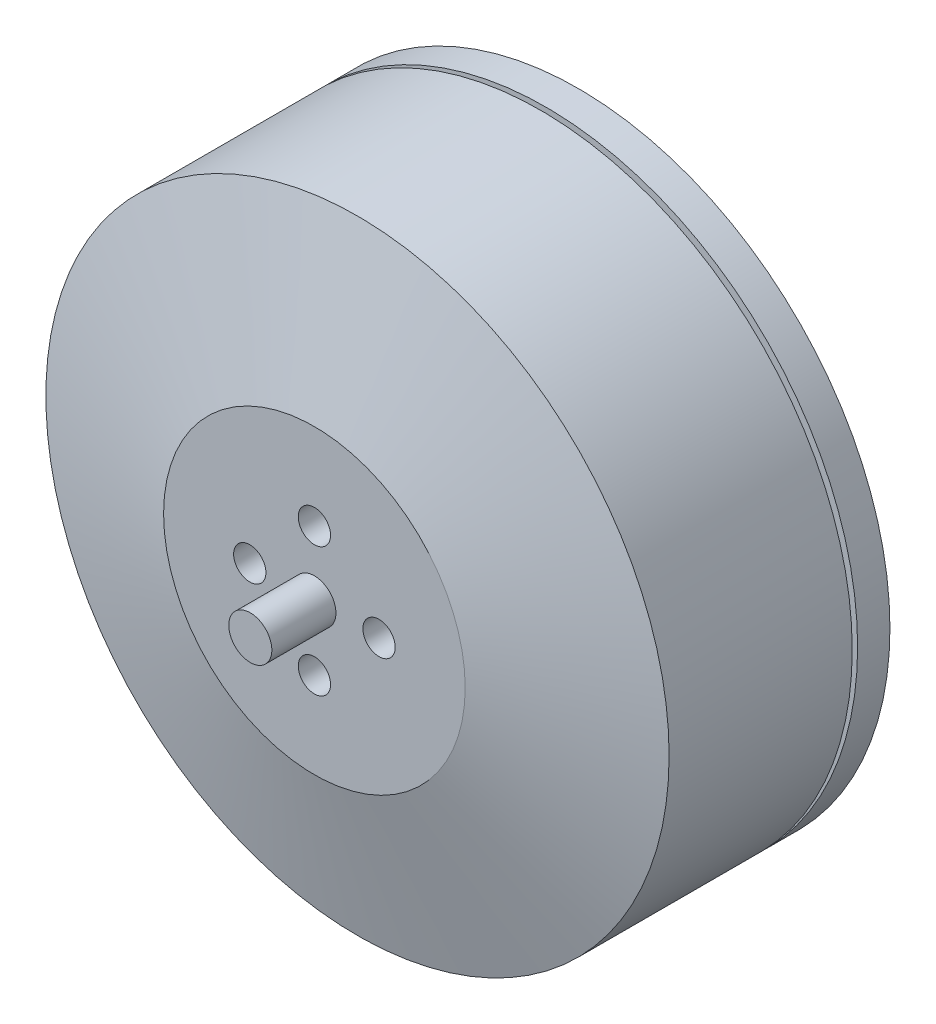
ISO-10303-21;
HEADER;
FILE_DESCRIPTION(('STEP AP214'),'2;1');
FILE_NAME('part.step','',(''),(''),'','','');
FILE_SCHEMA(('AUTOMOTIVE_DESIGN { 1 0 10303 214 1 1 1 1 }'));
ENDSEC;
DATA;
#1=APPLICATION_CONTEXT('core data for automotive mechanical design processes');
#2=APPLICATION_PROTOCOL_DEFINITION('international standard','automotive_design',2000,#1);
#3=PRODUCT_CONTEXT('',#1,'mechanical');
#4=PRODUCT('Part','Part','',(#3));
#5=PRODUCT_RELATED_PRODUCT_CATEGORY('part','',(#4));
#6=PRODUCT_DEFINITION_FORMATION('','',#4);
#7=PRODUCT_DEFINITION_CONTEXT('part definition',#1,'design');
#8=PRODUCT_DEFINITION('design','',#6,#7);
#9=PRODUCT_DEFINITION_SHAPE('','',#8);
#10=(LENGTH_UNIT() NAMED_UNIT(*) SI_UNIT(.MILLI.,.METRE.));
#11=(NAMED_UNIT(*) PLANE_ANGLE_UNIT() SI_UNIT($,.RADIAN.));
#12=(NAMED_UNIT(*) SI_UNIT($,.STERADIAN.) SOLID_ANGLE_UNIT());
#13=UNCERTAINTY_MEASURE_WITH_UNIT(LENGTH_MEASURE(1.E-05),#10,'distance_accuracy_value','');
#14=(GEOMETRIC_REPRESENTATION_CONTEXT(3) GLOBAL_UNCERTAINTY_ASSIGNED_CONTEXT((#13)) GLOBAL_UNIT_ASSIGNED_CONTEXT((#10,
#11,#12)) REPRESENTATION_CONTEXT('',''));
#15=CARTESIAN_POINT('',(0.,0.,0.));
#16=DIRECTION('',(0.,0.,1.));
#17=DIRECTION('',(1.,0.,0.));
#18=AXIS2_PLACEMENT_3D('',#15,#16,#17);
#19=CARTESIAN_POINT('',(0.,0.,29.5));
#20=DIRECTION('',(0.,0.,-1.));
#21=DIRECTION('',(-1.,0.,0.));
#22=AXIS2_PLACEMENT_3D('',#19,#20,#21);
#23=PLANE('',#22);
#24=CARTESIAN_POINT('',(0.,6.,29.5));
#25=DIRECTION('',(0.,0.,1.));
#26=DIRECTION('',(1.,0.,0.));
#27=AXIS2_PLACEMENT_3D('',#24,#25,#26);
#28=CIRCLE('',#27,1.5);
#29=CARTESIAN_POINT('',(1.5,6.,29.5));
#30=VERTEX_POINT('',#29);
#31=EDGE_CURVE('E193',#30,#30,#28,.T.);
#32=ORIENTED_EDGE('',*,*,#31,.F.);
#33=EDGE_LOOP('',(#32));
#34=FACE_BOUND('',#33,.T.);
#35=CARTESIAN_POINT('',(6.,0.,29.5));
#36=DIRECTION('',(0.,0.,1.));
#37=DIRECTION('',(1.,0.,0.));
#38=AXIS2_PLACEMENT_3D('',#35,#36,#37);
#39=CIRCLE('',#38,1.5);
#40=CARTESIAN_POINT('',(7.5,0.,29.5));
#41=VERTEX_POINT('',#40);
#42=EDGE_CURVE('E196',#41,#41,#39,.T.);
#43=ORIENTED_EDGE('',*,*,#42,.F.);
#44=EDGE_LOOP('',(#43));
#45=FACE_BOUND('',#44,.T.);
#46=CARTESIAN_POINT('',(0.,-6.,29.5));
#47=DIRECTION('',(0.,0.,1.));
#48=DIRECTION('',(1.,0.,0.));
#49=AXIS2_PLACEMENT_3D('',#46,#47,#48);
#50=CIRCLE('',#49,1.5);
#51=CARTESIAN_POINT('',(1.5,-6.,29.5));
#52=VERTEX_POINT('',#51);
#53=EDGE_CURVE('E203',#52,#52,#50,.T.);
#54=ORIENTED_EDGE('',*,*,#53,.F.);
#55=EDGE_LOOP('',(#54));
#56=FACE_BOUND('',#55,.T.);
#57=CARTESIAN_POINT('',(-6.,0.,29.5));
#58=DIRECTION('',(0.,0.,1.));
#59=DIRECTION('',(1.,0.,0.));
#60=AXIS2_PLACEMENT_3D('',#57,#58,#59);
#61=CIRCLE('',#60,1.5);
#62=CARTESIAN_POINT('',(-4.5,0.,29.5));
#63=VERTEX_POINT('',#62);
#64=EDGE_CURVE('E211',#63,#63,#61,.T.);
#65=ORIENTED_EDGE('',*,*,#64,.F.);
#66=EDGE_LOOP('',(#65));
#67=FACE_BOUND('',#66,.T.);
#68=CARTESIAN_POINT('',(0.,0.,29.5));
#69=DIRECTION('',(0.,0.,-1.));
#70=DIRECTION('',(-1.,0.,0.));
#71=AXIS2_PLACEMENT_3D('',#68,#69,#70);
#72=CIRCLE('',#71,2.);
#73=CARTESIAN_POINT('',(-2.,0.,29.5));
#74=VERTEX_POINT('',#73);
#75=EDGE_CURVE('E55',#74,#74,#72,.F.);
#76=ORIENTED_EDGE('',*,*,#75,.F.);
#77=EDGE_LOOP('',(#76));
#78=FACE_BOUND('',#77,.T.);
#79=CARTESIAN_POINT('',(0.,0.,29.5));
#80=DIRECTION('',(0.,0.,1.));
#81=DIRECTION('',(1.,0.,0.));
#82=AXIS2_PLACEMENT_3D('',#79,#80,#81);
#83=CIRCLE('',#82,14.);
#84=CARTESIAN_POINT('',(14.,0.,29.5));
#85=VERTEX_POINT('',#84);
#86=EDGE_CURVE('E254',#85,#85,#83,.T.);
#87=ORIENTED_EDGE('',*,*,#86,.T.);
#88=EDGE_LOOP('',(#87));
#89=FACE_BOUND('',#88,.T.);
#90=ADVANCED_FACE('F47',(#34,#45,#56,#67,#78,#89),#23,.F.);
#91=CARTESIAN_POINT('',(0.,0.,25.5));
#92=DIRECTION('',(0.,0.,-1.));
#93=DIRECTION('',(-1.,0.,0.));
#94=AXIS2_PLACEMENT_3D('',#91,#92,#93);
#95=CONICAL_SURFACE('',#94,28.93,1.30902702580434);
#96=ORIENTED_EDGE('',*,*,#86,.F.);
#97=EDGE_LOOP('',(#96));
#98=FACE_BOUND('',#97,.T.);
#99=CARTESIAN_POINT('',(0.,0.,25.5));
#100=DIRECTION('',(0.,0.,1.));
#101=DIRECTION('',(1.,0.,0.));
#102=AXIS2_PLACEMENT_3D('',#99,#100,#101);
#103=CIRCLE('',#102,28.93);
#104=CARTESIAN_POINT('',(28.93,0.,25.5));
#105=VERTEX_POINT('',#104);
#106=EDGE_CURVE('E250',#105,#105,#103,.T.);
#107=ORIENTED_EDGE('',*,*,#106,.T.);
#108=EDGE_LOOP('',(#107));
#109=FACE_BOUND('',#108,.T.);
#110=ADVANCED_FACE('F264',(#98,#109),#95,.T.);
#111=CARTESIAN_POINT('',(0.,0.,66.2833849222222));
#112=DIRECTION('',(0.,0.,1.));
#113=DIRECTION('',(1.,0.,0.));
#114=AXIS2_PLACEMENT_3D('',#111,#112,#113);
#115=CYLINDRICAL_SURFACE('',#114,28.93);
#116=ORIENTED_EDGE('',*,*,#106,.F.);
#117=EDGE_LOOP('',(#116));
#118=FACE_BOUND('',#117,.T.);
#119=CARTESIAN_POINT('',(0.,0.,8.5));
#120=DIRECTION('',(0.,0.,1.));
#121=DIRECTION('',(1.,0.,0.));
#122=AXIS2_PLACEMENT_3D('',#119,#120,#121);
#123=CIRCLE('',#122,28.93);
#124=CARTESIAN_POINT('',(28.93,0.,8.5));
#125=VERTEX_POINT('',#124);
#126=EDGE_CURVE('E246',#125,#125,#123,.T.);
#127=ORIENTED_EDGE('',*,*,#126,.T.);
#128=EDGE_LOOP('',(#127));
#129=FACE_BOUND('',#128,.T.);
#130=ADVANCED_FACE('F270',(#118,#129),#115,.T.);
#131=CARTESIAN_POINT('',(0.,28.93,8.5));
#132=DIRECTION('',(0.,0.,1.));
#133=DIRECTION('',(1.,0.,0.));
#134=AXIS2_PLACEMENT_3D('',#131,#132,#133);
#135=PLANE('',#134);
#136=ORIENTED_EDGE('',*,*,#126,.F.);
#137=EDGE_LOOP('',(#136));
#138=FACE_BOUND('',#137,.T.);
#139=CARTESIAN_POINT('',(0.,0.,8.5));
#140=DIRECTION('',(0.,0.,1.));
#141=DIRECTION('',(1.,0.,0.));
#142=AXIS2_PLACEMENT_3D('',#139,#140,#141);
#143=CIRCLE('',#142,26.93);
#144=CARTESIAN_POINT('',(26.93,0.,8.5));
#145=VERTEX_POINT('',#144);
#146=EDGE_CURVE('E242',#145,#145,#143,.T.);
#147=ORIENTED_EDGE('',*,*,#146,.T.);
#148=EDGE_LOOP('',(#147));
#149=FACE_BOUND('',#148,.T.);
#150=ADVANCED_FACE('F275',(#138,#149),#135,.F.);
#151=CARTESIAN_POINT('',(0.,0.,66.2833849222222));
#152=DIRECTION('',(0.,0.,1.));
#153=DIRECTION('',(1.,0.,0.));
#154=AXIS2_PLACEMENT_3D('',#151,#152,#153);
#155=CYLINDRICAL_SURFACE('',#154,26.93);
#156=ORIENTED_EDGE('',*,*,#146,.F.);
#157=EDGE_LOOP('',(#156));
#158=FACE_BOUND('',#157,.T.);
#159=CARTESIAN_POINT('',(0.,0.,8.));
#160=DIRECTION('',(0.,0.,1.));
#161=DIRECTION('',(1.,0.,0.));
#162=AXIS2_PLACEMENT_3D('',#159,#160,#161);
#163=CIRCLE('',#162,26.93);
#164=CARTESIAN_POINT('',(26.93,0.,8.));
#165=VERTEX_POINT('',#164);
#166=EDGE_CURVE('E238',#165,#165,#163,.T.);
#167=ORIENTED_EDGE('',*,*,#166,.T.);
#168=EDGE_LOOP('',(#167));
#169=FACE_BOUND('',#168,.T.);
#170=ADVANCED_FACE('F281',(#158,#169),#155,.T.);
#171=CARTESIAN_POINT('',(0.,26.93,8.));
#172=DIRECTION('',(0.,0.,-1.));
#173=DIRECTION('',(-1.,0.,0.));
#174=AXIS2_PLACEMENT_3D('',#171,#172,#173);
#175=PLANE('',#174);
#176=ORIENTED_EDGE('',*,*,#166,.F.);
#177=EDGE_LOOP('',(#176));
#178=FACE_BOUND('',#177,.T.);
#179=CARTESIAN_POINT('',(0.,0.,8.));
#180=DIRECTION('',(0.,0.,1.));
#181=DIRECTION('',(1.,0.,0.));
#182=AXIS2_PLACEMENT_3D('',#179,#180,#181);
#183=CIRCLE('',#182,28.93);
#184=CARTESIAN_POINT('',(28.93,0.,8.));
#185=VERTEX_POINT('',#184);
#186=EDGE_CURVE('E234',#185,#185,#183,.T.);
#187=ORIENTED_EDGE('',*,*,#186,.T.);
#188=EDGE_LOOP('',(#187));
#189=FACE_BOUND('',#188,.T.);
#190=ADVANCED_FACE('F287',(#178,#189),#175,.F.);
#191=CARTESIAN_POINT('',(0.,0.,66.2833849222222));
#192=DIRECTION('',(0.,0.,1.));
#193=DIRECTION('',(1.,0.,0.));
#194=AXIS2_PLACEMENT_3D('',#191,#192,#193);
#195=CYLINDRICAL_SURFACE('',#194,28.93);
#196=ORIENTED_EDGE('',*,*,#186,.F.);
#197=EDGE_LOOP('',(#196));
#198=FACE_BOUND('',#197,.T.);
#199=CARTESIAN_POINT('',(0.,0.,5.));
#200=DIRECTION('',(0.,0.,1.));
#201=DIRECTION('',(1.,0.,0.));
#202=AXIS2_PLACEMENT_3D('',#199,#200,#201);
#203=CIRCLE('',#202,28.93);
#204=CARTESIAN_POINT('',(28.93,0.,5.));
#205=VERTEX_POINT('',#204);
#206=EDGE_CURVE('E230',#205,#205,#203,.T.);
#207=ORIENTED_EDGE('',*,*,#206,.T.);
#208=EDGE_LOOP('',(#207));
#209=FACE_BOUND('',#208,.T.);
#210=ADVANCED_FACE('F293',(#198,#209),#195,.T.);
#211=CARTESIAN_POINT('',(0.,0.,0.));
#212=DIRECTION('',(0.,0.,1.));
#213=DIRECTION('',(1.,0.,0.));
#214=AXIS2_PLACEMENT_3D('',#211,#212,#213);
#215=CONICAL_SURFACE('',#214,17.75,1.1502506616406);
#216=ORIENTED_EDGE('',*,*,#206,.F.);
#217=EDGE_LOOP('',(#216));
#218=FACE_BOUND('',#217,.T.);
#219=CARTESIAN_POINT('',(0.,0.,0.));
#220=DIRECTION('',(0.,0.,1.));
#221=DIRECTION('',(1.,0.,0.));
#222=AXIS2_PLACEMENT_3D('',#219,#220,#221);
#223=CIRCLE('',#222,17.75);
#224=CARTESIAN_POINT('',(17.75,0.,0.));
#225=VERTEX_POINT('',#224);
#226=EDGE_CURVE('E227',#225,#225,#223,.T.);
#227=ORIENTED_EDGE('',*,*,#226,.T.);
#228=EDGE_LOOP('',(#227));
#229=FACE_BOUND('',#228,.T.);
#230=ADVANCED_FACE('F299',(#218,#229),#215,.T.);
#231=CARTESIAN_POINT('',(0.,17.75,0.));
#232=DIRECTION('',(0.,0.,1.));
#233=DIRECTION('',(1.,0.,0.));
#234=AXIS2_PLACEMENT_3D('',#231,#232,#233);
#235=PLANE('',#234);
#236=CARTESIAN_POINT('',(0.,12.5,0.));
#237=DIRECTION('',(0.,0.,-1.));
#238=DIRECTION('',(-1.,0.,0.));
#239=AXIS2_PLACEMENT_3D('',#236,#237,#238);
#240=CIRCLE('',#239,1.5);
#241=CARTESIAN_POINT('',(-1.5,12.5,0.));
#242=VERTEX_POINT('',#241);
#243=EDGE_CURVE('E168',#242,#242,#240,.T.);
#244=ORIENTED_EDGE('',*,*,#243,.F.);
#245=EDGE_LOOP('',(#244));
#246=FACE_BOUND('',#245,.T.);
#247=CARTESIAN_POINT('',(-12.5,0.,0.));
#248=DIRECTION('',(0.,0.,-1.));
#249=DIRECTION('',(-1.,0.,0.));
#250=AXIS2_PLACEMENT_3D('',#247,#248,#249);
#251=CIRCLE('',#250,1.5);
#252=CARTESIAN_POINT('',(-14.,0.,0.));
#253=VERTEX_POINT('',#252);
#254=EDGE_CURVE('E172',#253,#253,#251,.T.);
#255=ORIENTED_EDGE('',*,*,#254,.F.);
#256=EDGE_LOOP('',(#255));
#257=FACE_BOUND('',#256,.T.);
#258=CARTESIAN_POINT('',(0.,-12.5,0.));
#259=DIRECTION('',(0.,0.,-1.));
#260=DIRECTION('',(-1.,0.,0.));
#261=AXIS2_PLACEMENT_3D('',#258,#259,#260);
#262=CIRCLE('',#261,1.5);
#263=CARTESIAN_POINT('',(-1.5,-12.5,0.));
#264=VERTEX_POINT('',#263);
#265=EDGE_CURVE('E178',#264,#264,#262,.T.);
#266=ORIENTED_EDGE('',*,*,#265,.F.);
#267=EDGE_LOOP('',(#266));
#268=FACE_BOUND('',#267,.T.);
#269=CARTESIAN_POINT('',(12.5,0.,0.));
#270=DIRECTION('',(0.,0.,-1.));
#271=DIRECTION('',(-1.,0.,0.));
#272=AXIS2_PLACEMENT_3D('',#269,#270,#271);
#273=CIRCLE('',#272,1.5);
#274=CARTESIAN_POINT('',(11.,0.,0.));
#275=VERTEX_POINT('',#274);
#276=EDGE_CURVE('E184',#275,#275,#273,.T.);
#277=ORIENTED_EDGE('',*,*,#276,.F.);
#278=EDGE_LOOP('',(#277));
#279=FACE_BOUND('',#278,.T.);
#280=ORIENTED_EDGE('',*,*,#226,.F.);
#281=EDGE_LOOP('',(#280));
#282=FACE_BOUND('',#281,.T.);
#283=CARTESIAN_POINT('',(0.,0.,0.));
#284=DIRECTION('',(0.,0.,1.));
#285=DIRECTION('',(1.,0.,0.));
#286=AXIS2_PLACEMENT_3D('',#283,#284,#285);
#287=CIRCLE('',#286,9.);
#288=CARTESIAN_POINT('',(9.,0.,0.));
#289=VERTEX_POINT('',#288);
#290=EDGE_CURVE('E223',#289,#289,#287,.T.);
#291=ORIENTED_EDGE('',*,*,#290,.T.);
#292=EDGE_LOOP('',(#291));
#293=FACE_BOUND('',#292,.T.);
#294=ADVANCED_FACE('F305',(#246,#257,#268,#279,#282,#293),#235,.F.);
#295=CARTESIAN_POINT('',(0.,0.,1.49999999999999));
#296=DIRECTION('',(0.,0.,-1.));
#297=DIRECTION('',(-1.,0.,0.));
#298=AXIS2_PLACEMENT_3D('',#295,#296,#297);
#299=CONICAL_SURFACE('',#298,7.5,0.785398163397448);
#300=ORIENTED_EDGE('',*,*,#290,.F.);
#301=EDGE_LOOP('',(#300));
#302=FACE_BOUND('',#301,.T.);
#303=CARTESIAN_POINT('',(0.,0.,1.49999999999999));
#304=DIRECTION('',(0.,0.,1.));
#305=DIRECTION('',(1.,0.,0.));
#306=AXIS2_PLACEMENT_3D('',#303,#304,#305);
#307=CIRCLE('',#306,7.5);
#308=CARTESIAN_POINT('',(7.5,0.,1.49999999999999));
#309=VERTEX_POINT('',#308);
#310=EDGE_CURVE('E219',#309,#309,#307,.T.);
#311=ORIENTED_EDGE('',*,*,#310,.T.);
#312=EDGE_LOOP('',(#311));
#313=FACE_BOUND('',#312,.T.);
#314=ADVANCED_FACE('F311',(#302,#313),#299,.F.);
#315=CARTESIAN_POINT('',(0.,7.5,1.49999999999999));
#316=DIRECTION('',(0.,0.,1.));
#317=DIRECTION('',(1.,0.,0.));
#318=AXIS2_PLACEMENT_3D('',#315,#316,#317);
#319=PLANE('',#318);
#320=CARTESIAN_POINT('',(0.,0.,1.49999999999999));
#321=DIRECTION('',(0.,0.,-1.));
#322=DIRECTION('',(-1.,0.,0.));
#323=AXIS2_PLACEMENT_3D('',#320,#321,#322);
#324=CIRCLE('',#323,6.5);
#325=CARTESIAN_POINT('',(-6.5,0.,1.49999999999999));
#326=VERTEX_POINT('',#325);
#327=EDGE_CURVE('E354',#326,#326,#324,.T.);
#328=ORIENTED_EDGE('',*,*,#327,.F.);
#329=EDGE_LOOP('',(#328));
#330=FACE_BOUND('',#329,.T.);
#331=ORIENTED_EDGE('',*,*,#310,.F.);
#332=EDGE_LOOP('',(#331));
#333=FACE_BOUND('',#332,.T.);
#334=ADVANCED_FACE('F318',(#330,#333),#319,.F.);
#335=CARTESIAN_POINT('',(0.,0.,35.45));
#336=DIRECTION('',(0.,0.,-1.));
#337=DIRECTION('',(-1.,0.,0.));
#338=AXIS2_PLACEMENT_3D('',#335,#336,#337);
#339=CYLINDRICAL_SURFACE('',#338,2.);
#340=CARTESIAN_POINT('',(0.,0.,35.45));
#341=DIRECTION('',(0.,0.,1.));
#342=DIRECTION('',(1.,0.,0.));
#343=AXIS2_PLACEMENT_3D('',#340,#341,#342);
#344=CIRCLE('',#343,2.);
#345=CARTESIAN_POINT('',(2.,0.,35.45));
#346=VERTEX_POINT('',#345);
#347=EDGE_CURVE('E192',#346,#346,#344,.T.);
#348=ORIENTED_EDGE('',*,*,#347,.F.);
#349=EDGE_LOOP('',(#348));
#350=FACE_BOUND('',#349,.T.);
#351=ORIENTED_EDGE('',*,*,#75,.T.);
#352=EDGE_LOOP('',(#351));
#353=FACE_BOUND('',#352,.T.);
#354=ADVANCED_FACE('F260',(#350,#353),#339,.T.);
#355=CARTESIAN_POINT('',(0.,0.,35.45));
#356=DIRECTION('',(0.,0.,1.));
#357=DIRECTION('',(1.,0.,0.));
#358=AXIS2_PLACEMENT_3D('',#355,#356,#357);
#359=PLANE('',#358);
#360=ORIENTED_EDGE('',*,*,#347,.T.);
#361=EDGE_LOOP('',(#360));
#362=FACE_BOUND('',#361,.T.);
#363=ADVANCED_FACE('F329',(#362),#359,.T.);
#364=CARTESIAN_POINT('',(-6.,0.,24.5));
#365=DIRECTION('',(0.,0.,1.));
#366=DIRECTION('',(1.,0.,0.));
#367=AXIS2_PLACEMENT_3D('',#364,#365,#366);
#368=CYLINDRICAL_SURFACE('',#367,1.5);
#369=CARTESIAN_POINT('',(-6.,0.,24.5));
#370=DIRECTION('',(0.,0.,1.));
#371=DIRECTION('',(1.,0.,0.));
#372=AXIS2_PLACEMENT_3D('',#369,#370,#371);
#373=CIRCLE('',#372,1.5);
#374=CARTESIAN_POINT('',(-4.5,0.,24.5));
#375=VERTEX_POINT('',#374);
#376=EDGE_CURVE('E167',#375,#375,#373,.T.);
#377=ORIENTED_EDGE('',*,*,#376,.F.);
#378=EDGE_LOOP('',(#377));
#379=FACE_BOUND('',#378,.T.);
#380=ORIENTED_EDGE('',*,*,#64,.T.);
#381=EDGE_LOOP('',(#380));
#382=FACE_BOUND('',#381,.T.);
#383=ADVANCED_FACE('F459',(#379,#382),#368,.F.);
#384=CARTESIAN_POINT('',(-6.,0.,24.5));
#385=DIRECTION('',(0.,0.,1.));
#386=DIRECTION('',(1.,0.,0.));
#387=AXIS2_PLACEMENT_3D('',#384,#385,#386);
#388=PLANE('',#387);
#389=ORIENTED_EDGE('',*,*,#376,.T.);
#390=EDGE_LOOP('',(#389));
#391=FACE_BOUND('',#390,.T.);
#392=ADVANCED_FACE('F454',(#391),#388,.T.);
#393=CARTESIAN_POINT('',(0.,-6.,24.5));
#394=DIRECTION('',(0.,0.,1.));
#395=DIRECTION('',(1.,0.,0.));
#396=AXIS2_PLACEMENT_3D('',#393,#394,#395);
#397=CYLINDRICAL_SURFACE('',#396,1.5);
#398=CARTESIAN_POINT('',(0.,-6.,24.5));
#399=DIRECTION('',(0.,0.,1.));
#400=DIRECTION('',(1.,0.,0.));
#401=AXIS2_PLACEMENT_3D('',#398,#399,#400);
#402=CIRCLE('',#401,1.5);
#403=CARTESIAN_POINT('',(1.5,-6.,24.5));
#404=VERTEX_POINT('',#403);
#405=EDGE_CURVE('E207',#404,#404,#402,.T.);
#406=ORIENTED_EDGE('',*,*,#405,.F.);
#407=EDGE_LOOP('',(#406));
#408=FACE_BOUND('',#407,.T.);
#409=ORIENTED_EDGE('',*,*,#53,.T.);
#410=EDGE_LOOP('',(#409));
#411=FACE_BOUND('',#410,.T.);
#412=ADVANCED_FACE('F451',(#408,#411),#397,.F.);
#413=CARTESIAN_POINT('',(0.,-6.,24.5));
#414=DIRECTION('',(0.,0.,1.));
#415=DIRECTION('',(1.,0.,0.));
#416=AXIS2_PLACEMENT_3D('',#413,#414,#415);
#417=PLANE('',#416);
#418=ORIENTED_EDGE('',*,*,#405,.T.);
#419=EDGE_LOOP('',(#418));
#420=FACE_BOUND('',#419,.T.);
#421=ADVANCED_FACE('F446',(#420),#417,.T.);
#422=CARTESIAN_POINT('',(6.,0.,24.5));
#423=DIRECTION('',(0.,0.,1.));
#424=DIRECTION('',(1.,0.,0.));
#425=AXIS2_PLACEMENT_3D('',#422,#423,#424);
#426=CYLINDRICAL_SURFACE('',#425,1.5);
#427=CARTESIAN_POINT('',(6.,0.,24.5));
#428=DIRECTION('',(0.,0.,1.));
#429=DIRECTION('',(1.,0.,0.));
#430=AXIS2_PLACEMENT_3D('',#427,#428,#429);
#431=CIRCLE('',#430,1.5);
#432=CARTESIAN_POINT('',(7.5,0.,24.5));
#433=VERTEX_POINT('',#432);
#434=EDGE_CURVE('E200',#433,#433,#431,.T.);
#435=ORIENTED_EDGE('',*,*,#434,.F.);
#436=EDGE_LOOP('',(#435));
#437=FACE_BOUND('',#436,.T.);
#438=ORIENTED_EDGE('',*,*,#42,.T.);
#439=EDGE_LOOP('',(#438));
#440=FACE_BOUND('',#439,.T.);
#441=ADVANCED_FACE('F443',(#437,#440),#426,.F.);
#442=CARTESIAN_POINT('',(6.,0.,24.5));
#443=DIRECTION('',(0.,0.,1.));
#444=DIRECTION('',(1.,0.,0.));
#445=AXIS2_PLACEMENT_3D('',#442,#443,#444);
#446=PLANE('',#445);
#447=ORIENTED_EDGE('',*,*,#434,.T.);
#448=EDGE_LOOP('',(#447));
#449=FACE_BOUND('',#448,.T.);
#450=ADVANCED_FACE('F441',(#449),#446,.T.);
#451=CARTESIAN_POINT('',(0.,6.,24.5));
#452=DIRECTION('',(0.,0.,1.));
#453=DIRECTION('',(1.,0.,0.));
#454=AXIS2_PLACEMENT_3D('',#451,#452,#453);
#455=CYLINDRICAL_SURFACE('',#454,1.5);
#456=CARTESIAN_POINT('',(0.,6.,24.5));
#457=DIRECTION('',(0.,0.,1.));
#458=DIRECTION('',(1.,0.,0.));
#459=AXIS2_PLACEMENT_3D('',#456,#457,#458);
#460=CIRCLE('',#459,1.5);
#461=CARTESIAN_POINT('',(1.5,6.,24.5));
#462=VERTEX_POINT('',#461);
#463=EDGE_CURVE('E189',#462,#462,#460,.T.);
#464=ORIENTED_EDGE('',*,*,#463,.F.);
#465=EDGE_LOOP('',(#464));
#466=FACE_BOUND('',#465,.T.);
#467=ORIENTED_EDGE('',*,*,#31,.T.);
#468=EDGE_LOOP('',(#467));
#469=FACE_BOUND('',#468,.T.);
#470=ADVANCED_FACE('F437',(#466,#469),#455,.F.);
#471=CARTESIAN_POINT('',(0.,6.,24.5));
#472=DIRECTION('',(0.,0.,1.));
#473=DIRECTION('',(1.,0.,0.));
#474=AXIS2_PLACEMENT_3D('',#471,#472,#473);
#475=PLANE('',#474);
#476=ORIENTED_EDGE('',*,*,#463,.T.);
#477=EDGE_LOOP('',(#476));
#478=FACE_BOUND('',#477,.T.);
#479=ADVANCED_FACE('F430',(#478),#475,.T.);
#480=CARTESIAN_POINT('',(12.5,0.,5.));
#481=DIRECTION('',(0.,0.,-1.));
#482=DIRECTION('',(-1.,0.,0.));
#483=AXIS2_PLACEMENT_3D('',#480,#481,#482);
#484=CYLINDRICAL_SURFACE('',#483,1.5);
#485=CARTESIAN_POINT('',(12.5,0.,5.));
#486=DIRECTION('',(0.,0.,-1.));
#487=DIRECTION('',(-1.,0.,0.));
#488=AXIS2_PLACEMENT_3D('',#485,#486,#487);
#489=CIRCLE('',#488,1.5);
#490=CARTESIAN_POINT('',(11.,0.,5.));
#491=VERTEX_POINT('',#490);
#492=EDGE_CURVE('E163',#491,#491,#489,.T.);
#493=ORIENTED_EDGE('',*,*,#492,.F.);
#494=EDGE_LOOP('',(#493));
#495=FACE_BOUND('',#494,.T.);
#496=ORIENTED_EDGE('',*,*,#276,.T.);
#497=EDGE_LOOP('',(#496));
#498=FACE_BOUND('',#497,.T.);
#499=ADVANCED_FACE('F427',(#495,#498),#484,.F.);
#500=CARTESIAN_POINT('',(12.5,0.,5.));
#501=DIRECTION('',(0.,0.,-1.));
#502=DIRECTION('',(-1.,0.,0.));
#503=AXIS2_PLACEMENT_3D('',#500,#501,#502);
#504=PLANE('',#503);
#505=ORIENTED_EDGE('',*,*,#492,.T.);
#506=EDGE_LOOP('',(#505));
#507=FACE_BOUND('',#506,.T.);
#508=ADVANCED_FACE('F422',(#507),#504,.T.);
#509=CARTESIAN_POINT('',(0.,-12.5,5.));
#510=DIRECTION('',(0.,0.,-1.));
#511=DIRECTION('',(-1.,0.,0.));
#512=AXIS2_PLACEMENT_3D('',#509,#510,#511);
#513=CYLINDRICAL_SURFACE('',#512,1.5);
#514=CARTESIAN_POINT('',(0.,-12.5,5.));
#515=DIRECTION('',(0.,0.,-1.));
#516=DIRECTION('',(-1.,0.,0.));
#517=AXIS2_PLACEMENT_3D('',#514,#515,#516);
#518=CIRCLE('',#517,1.5);
#519=CARTESIAN_POINT('',(-1.5,-12.5,5.));
#520=VERTEX_POINT('',#519);
#521=EDGE_CURVE('E181',#520,#520,#518,.T.);
#522=ORIENTED_EDGE('',*,*,#521,.F.);
#523=EDGE_LOOP('',(#522));
#524=FACE_BOUND('',#523,.T.);
#525=ORIENTED_EDGE('',*,*,#265,.T.);
#526=EDGE_LOOP('',(#525));
#527=FACE_BOUND('',#526,.T.);
#528=ADVANCED_FACE('F419',(#524,#527),#513,.F.);
#529=CARTESIAN_POINT('',(0.,-12.5,5.));
#530=DIRECTION('',(0.,0.,-1.));
#531=DIRECTION('',(-1.,0.,0.));
#532=AXIS2_PLACEMENT_3D('',#529,#530,#531);
#533=PLANE('',#532);
#534=ORIENTED_EDGE('',*,*,#521,.T.);
#535=EDGE_LOOP('',(#534));
#536=FACE_BOUND('',#535,.T.);
#537=ADVANCED_FACE('F414',(#536),#533,.T.);
#538=CARTESIAN_POINT('',(-12.5,0.,5.));
#539=DIRECTION('',(0.,0.,-1.));
#540=DIRECTION('',(-1.,0.,0.));
#541=AXIS2_PLACEMENT_3D('',#538,#539,#540);
#542=CYLINDRICAL_SURFACE('',#541,1.5);
#543=CARTESIAN_POINT('',(-12.5,0.,5.));
#544=DIRECTION('',(0.,0.,-1.));
#545=DIRECTION('',(-1.,0.,0.));
#546=AXIS2_PLACEMENT_3D('',#543,#544,#545);
#547=CIRCLE('',#546,1.5);
#548=CARTESIAN_POINT('',(-14.,0.,5.));
#549=VERTEX_POINT('',#548);
#550=EDGE_CURVE('E175',#549,#549,#547,.T.);
#551=ORIENTED_EDGE('',*,*,#550,.F.);
#552=EDGE_LOOP('',(#551));
#553=FACE_BOUND('',#552,.T.);
#554=ORIENTED_EDGE('',*,*,#254,.T.);
#555=EDGE_LOOP('',(#554));
#556=FACE_BOUND('',#555,.T.);
#557=ADVANCED_FACE('F411',(#553,#556),#542,.F.);
#558=CARTESIAN_POINT('',(-12.5,0.,5.));
#559=DIRECTION('',(0.,0.,-1.));
#560=DIRECTION('',(-1.,0.,0.));
#561=AXIS2_PLACEMENT_3D('',#558,#559,#560);
#562=PLANE('',#561);
#563=ORIENTED_EDGE('',*,*,#550,.T.);
#564=EDGE_LOOP('',(#563));
#565=FACE_BOUND('',#564,.T.);
#566=ADVANCED_FACE('F409',(#565),#562,.T.);
#567=CARTESIAN_POINT('',(0.,12.5,5.));
#568=DIRECTION('',(0.,0.,-1.));
#569=DIRECTION('',(-1.,0.,0.));
#570=AXIS2_PLACEMENT_3D('',#567,#568,#569);
#571=CYLINDRICAL_SURFACE('',#570,1.5);
#572=CARTESIAN_POINT('',(0.,12.5,5.));
#573=DIRECTION('',(0.,0.,-1.));
#574=DIRECTION('',(-1.,0.,0.));
#575=AXIS2_PLACEMENT_3D('',#572,#573,#574);
#576=CIRCLE('',#575,1.5);
#577=CARTESIAN_POINT('',(-1.5,12.5,5.));
#578=VERTEX_POINT('',#577);
#579=EDGE_CURVE('E164',#578,#578,#576,.T.);
#580=ORIENTED_EDGE('',*,*,#579,.F.);
#581=EDGE_LOOP('',(#580));
#582=FACE_BOUND('',#581,.T.);
#583=ORIENTED_EDGE('',*,*,#243,.T.);
#584=EDGE_LOOP('',(#583));
#585=FACE_BOUND('',#584,.T.);
#586=ADVANCED_FACE('F405',(#582,#585),#571,.F.);
#587=CARTESIAN_POINT('',(0.,12.5,5.));
#588=DIRECTION('',(0.,0.,-1.));
#589=DIRECTION('',(-1.,0.,0.));
#590=AXIS2_PLACEMENT_3D('',#587,#588,#589);
#591=PLANE('',#590);
#592=ORIENTED_EDGE('',*,*,#579,.T.);
#593=EDGE_LOOP('',(#592));
#594=FACE_BOUND('',#593,.T.);
#595=ADVANCED_FACE('F401',(#594),#591,.T.);
#596=CARTESIAN_POINT('',(0.,0.,1.59999999999999));
#597=DIRECTION('',(0.,0.,-1.));
#598=DIRECTION('',(-1.,0.,0.));
#599=AXIS2_PLACEMENT_3D('',#596,#597,#598);
#600=CYLINDRICAL_SURFACE('',#599,6.5);
#601=CARTESIAN_POINT('',(0.,0.,1.59999999999999));
#602=DIRECTION('',(0.,0.,-1.));
#603=DIRECTION('',(-1.,0.,0.));
#604=AXIS2_PLACEMENT_3D('',#601,#602,#603);
#605=CIRCLE('',#604,6.5);
#606=CARTESIAN_POINT('',(-6.5,0.,1.59999999999999));
#607=VERTEX_POINT('',#606);
#608=EDGE_CURVE('E137',#607,#607,#605,.T.);
#609=ORIENTED_EDGE('',*,*,#608,.F.);
#610=EDGE_LOOP('',(#609));
#611=FACE_BOUND('',#610,.T.);
#612=ORIENTED_EDGE('',*,*,#327,.T.);
#613=EDGE_LOOP('',(#612));
#614=FACE_BOUND('',#613,.T.);
#615=ADVANCED_FACE('F404',(#611,#614),#600,.F.);
#616=CARTESIAN_POINT('',(0.,0.,1.59999999999999));
#617=DIRECTION('',(0.,0.,-1.));
#618=DIRECTION('',(-1.,0.,0.));
#619=AXIS2_PLACEMENT_3D('',#616,#617,#618);
#620=PLANE('',#619);
#621=CARTESIAN_POINT('',(0.,0.,1.59999999999999));
#622=DIRECTION('',(0.,0.,-1.));
#623=DIRECTION('',(-1.,0.,0.));
#624=AXIS2_PLACEMENT_3D('',#621,#622,#623);
#625=CIRCLE('',#624,5.5);
#626=CARTESIAN_POINT('',(-5.5,0.,1.59999999999999));
#627=VERTEX_POINT('',#626);
#628=EDGE_CURVE('E349',#627,#627,#625,.T.);
#629=ORIENTED_EDGE('',*,*,#628,.F.);
#630=EDGE_LOOP('',(#629));
#631=FACE_BOUND('',#630,.T.);
#632=ORIENTED_EDGE('',*,*,#608,.T.);
#633=EDGE_LOOP('',(#632));
#634=FACE_BOUND('',#633,.T.);
#635=ADVANCED_FACE('F546',(#631,#634),#620,.T.);
#636=CARTESIAN_POINT('',(0.,0.,1.59999999999999));
#637=DIRECTION('',(0.,0.,-1.));
#638=DIRECTION('',(-1.,0.,0.));
#639=AXIS2_PLACEMENT_3D('',#636,#637,#638);
#640=CYLINDRICAL_SURFACE('',#639,5.5);
#641=ORIENTED_EDGE('',*,*,#628,.T.);
#642=EDGE_LOOP('',(#641));
#643=FACE_BOUND('',#642,.T.);
#644=CARTESIAN_POINT('',(0.,0.,1.49999999999999));
#645=DIRECTION('',(0.,0.,-1.));
#646=DIRECTION('',(-1.,0.,0.));
#647=AXIS2_PLACEMENT_3D('',#644,#645,#646);
#648=CIRCLE('',#647,5.5);
#649=CARTESIAN_POINT('',(-5.5,0.,1.49999999999999));
#650=VERTEX_POINT('',#649);
#651=EDGE_CURVE('E346',#650,#650,#648,.T.);
#652=ORIENTED_EDGE('',*,*,#651,.F.);
#653=EDGE_LOOP('',(#652));
#654=FACE_BOUND('',#653,.T.);
#655=ADVANCED_FACE('F555',(#643,#654),#640,.T.);
#656=CARTESIAN_POINT('',(0.,0.,-1.20000000000001));
#657=DIRECTION('',(0.,0.,-1.));
#658=DIRECTION('',(-1.,0.,0.));
#659=AXIS2_PLACEMENT_3D('',#656,#657,#658);
#660=PLANE('',#659);
#661=DIRECTION('',(-0.866025403784439,-0.5,0.));
#662=VECTOR('',#661,1.);
#663=CARTESIAN_POINT('',(1.,-0.577350269189625,-1.20000000000001));
#664=LINE('',#663,#662);
#665=CARTESIAN_POINT('',(1.,-0.577350269189625,-1.20000000000001));
#666=VERTEX_POINT('',#665);
#667=CARTESIAN_POINT('',(0.,-1.15470053837925,-1.20000000000001));
#668=VERTEX_POINT('',#667);
#669=EDGE_CURVE('E147',#666,#668,#664,.T.);
#670=ORIENTED_EDGE('',*,*,#669,.T.);
#671=DIRECTION('',(-0.866025403784439,0.5,0.));
#672=VECTOR('',#671,1.);
#673=CARTESIAN_POINT('',(0.,-1.15470053837925,-1.20000000000001));
#674=LINE('',#673,#672);
#675=CARTESIAN_POINT('',(-0.999999999999999,-0.577350269189626,-1.20000000000001));
#676=VERTEX_POINT('',#675);
#677=EDGE_CURVE('E129',#668,#676,#674,.T.);
#678=ORIENTED_EDGE('',*,*,#677,.T.);
#679=DIRECTION('',(0.,1.,0.));
#680=VECTOR('',#679,1.);
#681=CARTESIAN_POINT('',(-0.999999999999999,-0.577350269189626,-1.20000000000001));
#682=LINE('',#681,#680);
#683=CARTESIAN_POINT('',(-1.,0.577350269189627,-1.20000000000001));
#684=VERTEX_POINT('',#683);
#685=EDGE_CURVE('E127',#676,#684,#682,.T.);
#686=ORIENTED_EDGE('',*,*,#685,.T.);
#687=DIRECTION('',(0.866025403784439,0.5,0.));
#688=VECTOR('',#687,1.);
#689=CARTESIAN_POINT('',(-1.,0.577350269189627,-1.20000000000001));
#690=LINE('',#689,#688);
#691=CARTESIAN_POINT('',(0.,1.15470053837925,-1.20000000000001));
#692=VERTEX_POINT('',#691);
#693=EDGE_CURVE('E109',#684,#692,#690,.T.);
#694=ORIENTED_EDGE('',*,*,#693,.T.);
#695=DIRECTION('',(0.866025403784438,-0.5,0.));
#696=VECTOR('',#695,1.);
#697=CARTESIAN_POINT('',(0.,1.15470053837925,-1.20000000000001));
#698=LINE('',#697,#696);
#699=CARTESIAN_POINT('',(1.,0.577350269189626,-1.20000000000001));
#700=VERTEX_POINT('',#699);
#701=EDGE_CURVE('E117',#692,#700,#698,.T.);
#702=ORIENTED_EDGE('',*,*,#701,.T.);
#703=DIRECTION('',(0.,-1.,0.));
#704=VECTOR('',#703,1.);
#705=CARTESIAN_POINT('',(1.,0.577350269189626,-1.20000000000001));
#706=LINE('',#705,#704);
#707=EDGE_CURVE('E121',#700,#666,#706,.T.);
#708=ORIENTED_EDGE('',*,*,#707,.T.);
#709=EDGE_LOOP('',(#670,#678,#686,#694,#702,#708));
#710=FACE_BOUND('',#709,.T.);
#711=ADVANCED_FACE('F124',(#710),#660,.T.);
#712=CARTESIAN_POINT('',(0.,-1.15470053837925,-1.20000000000001));
#713=DIRECTION('',(-0.5,-0.866025403784438,0.));
#714=DIRECTION('',(0.866025403784439,-0.5,0.));
#715=AXIS2_PLACEMENT_3D('',#712,#713,#714);
#716=PLANE('',#715);
#717=DIRECTION('',(-0.866025403784439,0.5,0.));
#718=VECTOR('',#717,1.);
#719=CARTESIAN_POINT('',(0.,-1.15470053837925,-2.70000000000001));
#720=LINE('',#719,#718);
#721=CARTESIAN_POINT('',(0.,-1.15470053837925,-2.70000000000001));
#722=VERTEX_POINT('',#721);
#723=CARTESIAN_POINT('',(-0.999999999999999,-0.577350269189626,-2.70000000000001));
#724=VERTEX_POINT('',#723);
#725=EDGE_CURVE('E136',#722,#724,#720,.T.);
#726=ORIENTED_EDGE('',*,*,#725,.T.);
#727=DIRECTION('',(0.,0.,-1.));
#728=VECTOR('',#727,1.);
#729=CARTESIAN_POINT('',(-0.999999999999999,-0.577350269189626,-1.20000000000001));
#730=LINE('',#729,#728);
#731=EDGE_CURVE('E152',#676,#724,#730,.T.);
#732=ORIENTED_EDGE('',*,*,#731,.F.);
#733=ORIENTED_EDGE('',*,*,#677,.F.);
#734=DIRECTION('',(0.,0.,-1.));
#735=VECTOR('',#734,1.);
#736=CARTESIAN_POINT('',(0.,-1.15470053837925,-1.20000000000001));
#737=LINE('',#736,#735);
#738=EDGE_CURVE('E94',#668,#722,#737,.T.);
#739=ORIENTED_EDGE('',*,*,#738,.T.);
#740=EDGE_LOOP('',(#726,#732,#733,#739));
#741=FACE_BOUND('',#740,.T.);
#742=ADVANCED_FACE('F363',(#741),#716,.F.);
#743=CARTESIAN_POINT('',(-0.999999999999999,-0.577350269189626,-1.20000000000001));
#744=DIRECTION('',(-1.,0.,0.));
#745=DIRECTION('',(0.,-1.,0.));
#746=AXIS2_PLACEMENT_3D('',#743,#744,#745);
#747=PLANE('',#746);
#748=DIRECTION('',(0.,1.,0.));
#749=VECTOR('',#748,1.);
#750=CARTESIAN_POINT('',(-0.999999999999999,-0.577350269189626,-2.70000000000001));
#751=LINE('',#750,#749);
#752=CARTESIAN_POINT('',(-1.,0.577350269189627,-2.70000000000001));
#753=VERTEX_POINT('',#752);
#754=EDGE_CURVE('E140',#724,#753,#751,.T.);
#755=ORIENTED_EDGE('',*,*,#754,.T.);
#756=DIRECTION('',(0.,0.,-1.));
#757=VECTOR('',#756,1.);
#758=CARTESIAN_POINT('',(-1.,0.577350269189627,-1.20000000000001));
#759=LINE('',#758,#757);
#760=EDGE_CURVE('E114',#684,#753,#759,.T.);
#761=ORIENTED_EDGE('',*,*,#760,.F.);
#762=ORIENTED_EDGE('',*,*,#685,.F.);
#763=ORIENTED_EDGE('',*,*,#731,.T.);
#764=EDGE_LOOP('',(#755,#761,#762,#763));
#765=FACE_BOUND('',#764,.T.);
#766=ADVANCED_FACE('F367',(#765),#747,.F.);
#767=CARTESIAN_POINT('',(-1.,0.577350269189627,-1.20000000000001));
#768=DIRECTION('',(-0.5,0.866025403784439,0.));
#769=DIRECTION('',(-0.866025403784439,-0.5,0.));
#770=AXIS2_PLACEMENT_3D('',#767,#768,#769);
#771=PLANE('',#770);
#772=DIRECTION('',(0.866025403784439,0.5,0.));
#773=VECTOR('',#772,1.);
#774=CARTESIAN_POINT('',(-1.,0.577350269189627,-2.70000000000001));
#775=LINE('',#774,#773);
#776=CARTESIAN_POINT('',(0.,1.15470053837925,-2.70000000000001));
#777=VERTEX_POINT('',#776);
#778=EDGE_CURVE('E112',#753,#777,#775,.T.);
#779=ORIENTED_EDGE('',*,*,#778,.T.);
#780=DIRECTION('',(0.,0.,-1.));
#781=VECTOR('',#780,1.);
#782=CARTESIAN_POINT('',(0.,1.15470053837925,-1.20000000000001));
#783=LINE('',#782,#781);
#784=EDGE_CURVE('E105',#692,#777,#783,.T.);
#785=ORIENTED_EDGE('',*,*,#784,.F.);
#786=ORIENTED_EDGE('',*,*,#693,.F.);
#787=ORIENTED_EDGE('',*,*,#760,.T.);
#788=EDGE_LOOP('',(#779,#785,#786,#787));
#789=FACE_BOUND('',#788,.T.);
#790=ADVANCED_FACE('F107',(#789),#771,.F.);
#791=CARTESIAN_POINT('',(0.,1.15470053837925,-1.20000000000001));
#792=DIRECTION('',(0.5,0.866025403784439,0.));
#793=DIRECTION('',(-0.866025403784439,0.5,0.));
#794=AXIS2_PLACEMENT_3D('',#791,#792,#793);
#795=PLANE('',#794);
#796=DIRECTION('',(0.866025403784438,-0.5,0.));
#797=VECTOR('',#796,1.);
#798=CARTESIAN_POINT('',(0.,1.15470053837925,-2.70000000000001));
#799=LINE('',#798,#797);
#800=CARTESIAN_POINT('',(1.,0.577350269189626,-2.70000000000001));
#801=VERTEX_POINT('',#800);
#802=EDGE_CURVE('E62',#777,#801,#799,.T.);
#803=ORIENTED_EDGE('',*,*,#802,.T.);
#804=DIRECTION('',(0.,0.,-1.));
#805=VECTOR('',#804,1.);
#806=CARTESIAN_POINT('',(1.,0.577350269189626,-1.20000000000001));
#807=LINE('',#806,#805);
#808=EDGE_CURVE('E113',#700,#801,#807,.T.);
#809=ORIENTED_EDGE('',*,*,#808,.F.);
#810=ORIENTED_EDGE('',*,*,#701,.F.);
#811=ORIENTED_EDGE('',*,*,#784,.T.);
#812=EDGE_LOOP('',(#803,#809,#810,#811));
#813=FACE_BOUND('',#812,.T.);
#814=ADVANCED_FACE('F118',(#813),#795,.F.);
#815=CARTESIAN_POINT('',(1.,0.577350269189626,-1.20000000000001));
#816=DIRECTION('',(1.,0.,0.));
#817=DIRECTION('',(0.,0.,-1.));
#818=AXIS2_PLACEMENT_3D('',#815,#816,#817);
#819=PLANE('',#818);
#820=DIRECTION('',(0.,-1.,0.));
#821=VECTOR('',#820,1.);
#822=CARTESIAN_POINT('',(1.,0.577350269189626,-2.70000000000001));
#823=LINE('',#822,#821);
#824=CARTESIAN_POINT('',(1.,-0.577350269189625,-2.70000000000001));
#825=VERTEX_POINT('',#824);
#826=EDGE_CURVE('E145',#801,#825,#823,.T.);
#827=ORIENTED_EDGE('',*,*,#826,.T.);
#828=DIRECTION('',(0.,0.,-1.));
#829=VECTOR('',#828,1.);
#830=CARTESIAN_POINT('',(1.,-0.577350269189625,-1.20000000000001));
#831=LINE('',#830,#829);
#832=EDGE_CURVE('E71',#666,#825,#831,.T.);
#833=ORIENTED_EDGE('',*,*,#832,.F.);
#834=ORIENTED_EDGE('',*,*,#707,.F.);
#835=ORIENTED_EDGE('',*,*,#808,.T.);
#836=EDGE_LOOP('',(#827,#833,#834,#835));
#837=FACE_BOUND('',#836,.T.);
#838=ADVANCED_FACE('F373',(#837),#819,.F.);
#839=CARTESIAN_POINT('',(1.,-0.577350269189625,-1.20000000000001));
#840=DIRECTION('',(0.5,-0.866025403784439,0.));
#841=DIRECTION('',(0.866025403784439,0.5,0.));
#842=AXIS2_PLACEMENT_3D('',#839,#840,#841);
#843=PLANE('',#842);
#844=DIRECTION('',(-0.866025403784439,-0.5,0.));
#845=VECTOR('',#844,1.);
#846=CARTESIAN_POINT('',(1.,-0.577350269189625,-2.70000000000001));
#847=LINE('',#846,#845);
#848=EDGE_CURVE('E134',#825,#722,#847,.T.);
#849=ORIENTED_EDGE('',*,*,#848,.T.);
#850=ORIENTED_EDGE('',*,*,#738,.F.);
#851=ORIENTED_EDGE('',*,*,#669,.F.);
#852=ORIENTED_EDGE('',*,*,#832,.T.);
#853=EDGE_LOOP('',(#849,#850,#851,#852));
#854=FACE_BOUND('',#853,.T.);
#855=ADVANCED_FACE('F375',(#854),#843,.F.);
#856=CARTESIAN_POINT('',(0.,0.,-2.70000000000001));
#857=DIRECTION('',(0.,0.,-1.));
#858=DIRECTION('',(-1.,0.,0.));
#859=AXIS2_PLACEMENT_3D('',#856,#857,#858);
#860=PLANE('',#859);
#861=ORIENTED_EDGE('',*,*,#848,.F.);
#862=ORIENTED_EDGE('',*,*,#826,.F.);
#863=ORIENTED_EDGE('',*,*,#802,.F.);
#864=ORIENTED_EDGE('',*,*,#778,.F.);
#865=ORIENTED_EDGE('',*,*,#754,.F.);
#866=ORIENTED_EDGE('',*,*,#725,.F.);
#867=EDGE_LOOP('',(#861,#862,#863,#864,#865,#866));
#868=FACE_BOUND('',#867,.T.);
#869=CARTESIAN_POINT('',(0.,0.,-2.70000000000001));
#870=DIRECTION('',(0.,0.,-1.));
#871=DIRECTION('',(-1.,0.,0.));
#872=AXIS2_PLACEMENT_3D('',#869,#870,#871);
#873=CIRCLE('',#872,2.8);
#874=CARTESIAN_POINT('',(-2.8,0.,-2.70000000000001));
#875=VERTEX_POINT('',#874);
#876=EDGE_CURVE('E155',#875,#875,#873,.T.);
#877=ORIENTED_EDGE('',*,*,#876,.T.);
#878=EDGE_LOOP('',(#877));
#879=FACE_BOUND('',#878,.T.);
#880=ADVANCED_FACE('F370',(#868,#879),#860,.T.);
#881=CARTESIAN_POINT('',(0.,0.,-2.70000000000001));
#882=DIRECTION('',(0.,0.,-1.));
#883=DIRECTION('',(-1.,0.,0.));
#884=AXIS2_PLACEMENT_3D('',#881,#882,#883);
#885=CYLINDRICAL_SURFACE('',#884,2.8);
#886=ORIENTED_EDGE('',*,*,#876,.F.);
#887=EDGE_LOOP('',(#886));
#888=FACE_BOUND('',#887,.T.);
#889=CARTESIAN_POINT('',(0.,0.,-2.80000000000001));
#890=DIRECTION('',(0.,0.,-1.));
#891=DIRECTION('',(-1.,0.,0.));
#892=AXIS2_PLACEMENT_3D('',#889,#890,#891);
#893=CIRCLE('',#892,2.8);
#894=CARTESIAN_POINT('',(-2.8,0.,-2.80000000000001));
#895=VERTEX_POINT('',#894);
#896=EDGE_CURVE('E149',#895,#895,#893,.T.);
#897=ORIENTED_EDGE('',*,*,#896,.T.);
#898=EDGE_LOOP('',(#897));
#899=FACE_BOUND('',#898,.T.);
#900=ADVANCED_FACE('F394',(#888,#899),#885,.F.);
#901=CARTESIAN_POINT('',(0.,0.,-2.80000000000001));
#902=DIRECTION('',(0.,0.,-1.));
#903=DIRECTION('',(-1.,0.,0.));
#904=AXIS2_PLACEMENT_3D('',#901,#902,#903);
#905=PLANE('',#904);
#906=ORIENTED_EDGE('',*,*,#896,.F.);
#907=EDGE_LOOP('',(#906));
#908=FACE_BOUND('',#907,.T.);
#909=CARTESIAN_POINT('',(0.,0.,-2.80000000000001));
#910=DIRECTION('',(0.,0.,-1.));
#911=DIRECTION('',(-1.,0.,0.));
#912=AXIS2_PLACEMENT_3D('',#909,#910,#911);
#913=CIRCLE('',#912,4.25);
#914=CARTESIAN_POINT('',(4.25,0.,-2.80000000000001));
#915=VERTEX_POINT('',#914);
#916=EDGE_CURVE('E158',#915,#915,#913,.T.);
#917=ORIENTED_EDGE('',*,*,#916,.T.);
#918=EDGE_LOOP('',(#917));
#919=FACE_BOUND('',#918,.T.);
#920=ADVANCED_FACE('F339',(#908,#919),#905,.T.);
#921=CARTESIAN_POINT('',(0.,0.,-2.80000000000001));
#922=DIRECTION('',(0.,0.,1.));
#923=DIRECTION('',(1.,0.,0.));
#924=AXIS2_PLACEMENT_3D('',#921,#922,#923);
#925=CYLINDRICAL_SURFACE('',#924,4.25);
#926=CARTESIAN_POINT('',(0.,0.,1.49999999999999));
#927=DIRECTION('',(0.,0.,1.));
#928=DIRECTION('',(1.,0.,0.));
#929=AXIS2_PLACEMENT_3D('',#926,#927,#928);
#930=CIRCLE('',#929,4.25);
#931=CARTESIAN_POINT('',(4.25,0.,1.49999999999999));
#932=VERTEX_POINT('',#931);
#933=EDGE_CURVE('E11',#932,#932,#930,.F.);
#934=CARTESIAN_POINT('',(4.25,0.,-2.80000000000001));
#935=CARTESIAN_POINT('',(4.25,0.,-2.75520833333334));
#936=CARTESIAN_POINT('',(4.25,0.,-2.71041666666668));
#937=CARTESIAN_POINT('',(4.25,0.,-2.62083333333334));
#938=CARTESIAN_POINT('',(4.25,0.,-2.57604166666668));
#939=CARTESIAN_POINT('',(4.25,0.,-2.48645833333334));
#940=CARTESIAN_POINT('',(4.25,0.,-2.44166666666668));
#941=CARTESIAN_POINT('',(4.25,0.,-2.35208333333334));
#942=CARTESIAN_POINT('',(4.25,0.,-2.30729166666668));
#943=CARTESIAN_POINT('',(4.25,0.,-2.21770833333334));
#944=CARTESIAN_POINT('',(4.25,0.,-2.17291666666668));
#945=CARTESIAN_POINT('',(4.25,0.,-2.08333333333334));
#946=CARTESIAN_POINT('',(4.25,0.,-2.03854166666668));
#947=CARTESIAN_POINT('',(4.25,0.,-1.94895833333334));
#948=CARTESIAN_POINT('',(4.25,0.,-1.90416666666668));
#949=CARTESIAN_POINT('',(4.25,0.,-1.81458333333334));
#950=CARTESIAN_POINT('',(4.25,0.,-1.76979166666668));
#951=CARTESIAN_POINT('',(4.25,0.,-1.68020833333334));
#952=CARTESIAN_POINT('',(4.25,0.,-1.63541666666668));
#953=CARTESIAN_POINT('',(4.25,0.,-1.54583333333334));
#954=CARTESIAN_POINT('',(4.25,0.,-1.50104166666668));
#955=CARTESIAN_POINT('',(4.25,0.,-1.41145833333334));
#956=CARTESIAN_POINT('',(4.25,0.,-1.36666666666668));
#957=CARTESIAN_POINT('',(4.25,0.,-1.27708333333334));
#958=CARTESIAN_POINT('',(4.25,0.,-1.23229166666668));
#959=CARTESIAN_POINT('',(4.25,0.,-1.14270833333334));
#960=CARTESIAN_POINT('',(4.25,0.,-1.09791666666668));
#961=CARTESIAN_POINT('',(4.25,0.,-1.00833333333334));
#962=CARTESIAN_POINT('',(4.25,0.,-0.963541666666676));
#963=CARTESIAN_POINT('',(4.25,0.,-0.873958333333342));
#964=CARTESIAN_POINT('',(4.25,0.,-0.829166666666676));
#965=CARTESIAN_POINT('',(4.25,0.,-0.739583333333342));
#966=CARTESIAN_POINT('',(4.25,0.,-0.694791666666676));
#967=CARTESIAN_POINT('',(4.25,0.,-0.605208333333342));
#968=CARTESIAN_POINT('',(4.25,0.,-0.560416666666676));
#969=CARTESIAN_POINT('',(4.25,0.,-0.470833333333343));
#970=CARTESIAN_POINT('',(4.25,0.,-0.426041666666676));
#971=CARTESIAN_POINT('',(4.25,0.,-0.336458333333343));
#972=CARTESIAN_POINT('',(4.25,0.,-0.291666666666676));
#973=CARTESIAN_POINT('',(4.25,0.,-0.202083333333343));
#974=CARTESIAN_POINT('',(4.25,0.,-0.157291666666676));
#975=CARTESIAN_POINT('',(4.25,0.,-0.0677083333333425));
#976=CARTESIAN_POINT('',(4.25,0.,-0.0229166666666757));
#977=CARTESIAN_POINT('',(4.25,0.,0.0666666666666577));
#978=CARTESIAN_POINT('',(4.25,0.,0.111458333333324));
#979=CARTESIAN_POINT('',(4.25,0.,0.201041666666658));
#980=CARTESIAN_POINT('',(4.25,0.,0.245833333333324));
#981=CARTESIAN_POINT('',(4.25,0.,0.335416666666658));
#982=CARTESIAN_POINT('',(4.25,0.,0.380208333333324));
#983=CARTESIAN_POINT('',(4.25,0.,0.469791666666658));
#984=CARTESIAN_POINT('',(4.25,0.,0.514583333333324));
#985=CARTESIAN_POINT('',(4.25,0.,0.604166666666658));
#986=CARTESIAN_POINT('',(4.25,0.,0.648958333333324));
#987=CARTESIAN_POINT('',(4.25,0.,0.738541666666657));
#988=CARTESIAN_POINT('',(4.25,0.,0.783333333333324));
#989=CARTESIAN_POINT('',(4.25,0.,0.872916666666658));
#990=CARTESIAN_POINT('',(4.25,0.,0.917708333333324));
#991=CARTESIAN_POINT('',(4.25,0.,1.00729166666666));
#992=CARTESIAN_POINT('',(4.25,0.,1.05208333333332));
#993=CARTESIAN_POINT('',(4.25,0.,1.14166666666666));
#994=CARTESIAN_POINT('',(4.25,0.,1.18645833333332));
#995=CARTESIAN_POINT('',(4.25,0.,1.27604166666666));
#996=CARTESIAN_POINT('',(4.25,0.,1.32083333333332));
#997=CARTESIAN_POINT('',(4.25,0.,1.41041666666666));
#998=CARTESIAN_POINT('',(4.25,0.,1.45520833333332));
#999=CARTESIAN_POINT('',(4.25,0.,1.49999999999999));
#1000=B_SPLINE_CURVE_WITH_KNOTS('',3,(#934,#935,#936,#937,#938,#939,#940,#941,#942,#943,#944,
#945,#946,#947,#948,#949,#950,#951,#952,#953,#954,#955,#956,#957,#958,#959,#960,#961,#962,#963,
#964,#965,#966,#967,#968,#969,#970,#971,#972,#973,#974,#975,#976,#977,#978,#979,#980,#981,#982,
#983,#984,#985,#986,#987,#988,#989,#990,#991,#992,#993,#994,#995,#996,#997,#998,#999),
.UNSPECIFIED.,.F.,.F.,(4,2,2,2,2,2,2,2,2,2,2,2,2,2,2,2,2,2,2,2,2,2,2,2,2,2,2,2,2,2,2,2,4),(0.,
0.134375,0.26875,0.403125,0.5375,0.671875,0.80625,0.940625,1.075,1.209375,1.34375,1.478125,
1.6125,1.746875,1.88125,2.015625,2.15,2.284375,2.41875,2.553125,2.6875,2.821875,2.95625,
3.090625,3.225,3.359375,3.49375,3.628125,3.7625,3.896875,4.03125,4.165625,4.3),.UNSPECIFIED.);
#1001=EDGE_CURVE('BSEAM334',#915,#932,#1000,.T.);
#1002=ORIENTED_EDGE('',*,*,#916,.F.);
#1003=ORIENTED_EDGE('',*,*,#933,.T.);
#1004=ORIENTED_EDGE('',*,*,#1001,.T.);
#1005=ORIENTED_EDGE('',*,*,#1001,.F.);
#1006=EDGE_LOOP('',(#1002,#1004,#1003,#1005));
#1007=FACE_BOUND('',#1006,.T.);
#1008=ADVANCED_FACE('F334',(#1007),#925,.T.);
#1009=ORIENTED_EDGE('',*,*,#933,.F.);
#1010=EDGE_LOOP('',(#1009));
#1011=FACE_BOUND('',#1010,.T.);
#1012=ORIENTED_EDGE('',*,*,#651,.T.);
#1013=EDGE_LOOP('',(#1012));
#1014=FACE_BOUND('',#1013,.T.);
#1015=ADVANCED_FACE('F325',(#1011,#1014),#319,.F.);
#1016=CLOSED_SHELL('',(#90,#110,#130,#150,#170,#190,#210,#230,#294,#314,#334,#354,#363,#383,
#392,#412,#421,#441,#450,#470,#479,#499,#508,#528,#537,#557,#566,#586,#595,#615,#635,#655,#711,
#742,#766,#790,#814,#838,#855,#880,#900,#920,#1008,#1015));
#1017=MANIFOLD_SOLID_BREP('B2',#1016);
#1018=ADVANCED_BREP_SHAPE_REPRESENTATION('',(#18,#1017),#14);
#1019=SHAPE_DEFINITION_REPRESENTATION(#9,#1018);
ENDSEC;
END-ISO-10303-21;
